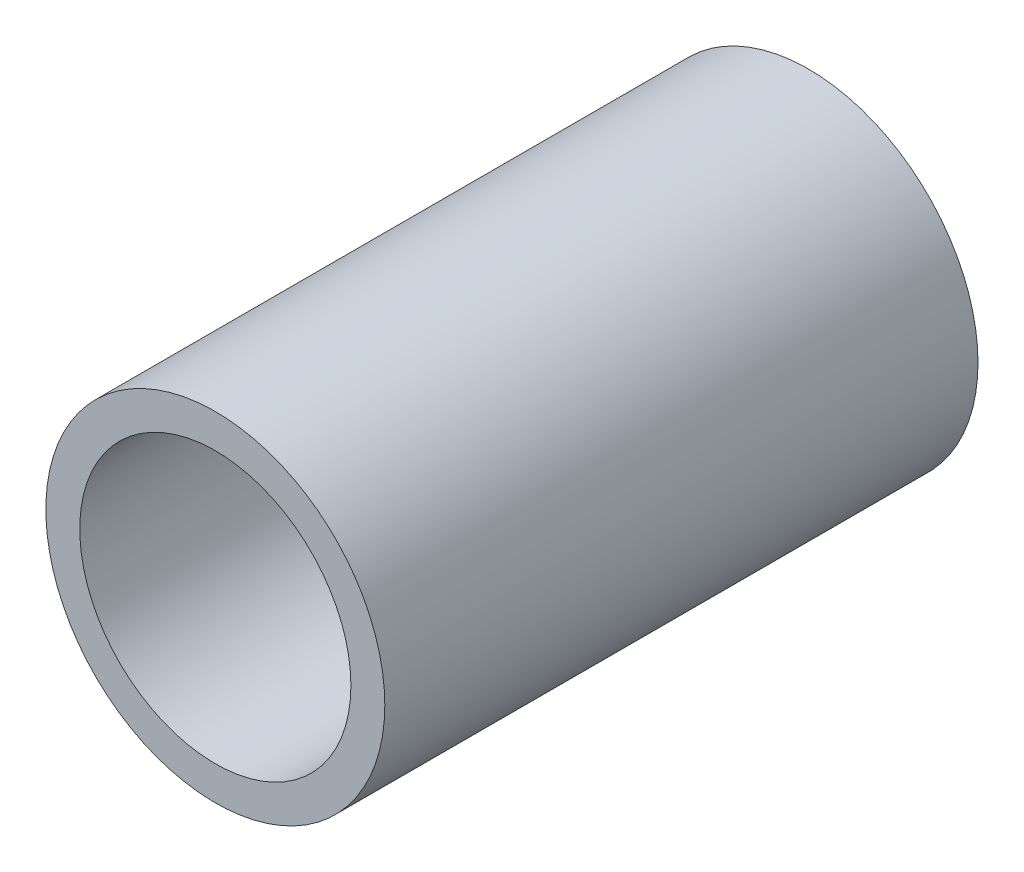
ISO-10303-21;
HEADER;
FILE_DESCRIPTION(('STEP AP214'),'2;1');
FILE_NAME('part.step','',(''),(''),'','','');
FILE_SCHEMA(('AUTOMOTIVE_DESIGN { 1 0 10303 214 1 1 1 1 }'));
ENDSEC;
DATA;
#1=APPLICATION_CONTEXT('core data for automotive mechanical design processes');
#2=APPLICATION_PROTOCOL_DEFINITION('international standard','automotive_design',2000,#1);
#3=PRODUCT_CONTEXT('',#1,'mechanical');
#4=PRODUCT('Part','Part','',(#3));
#5=PRODUCT_RELATED_PRODUCT_CATEGORY('part','',(#4));
#6=PRODUCT_DEFINITION_FORMATION('','',#4);
#7=PRODUCT_DEFINITION_CONTEXT('part definition',#1,'design');
#8=PRODUCT_DEFINITION('design','',#6,#7);
#9=PRODUCT_DEFINITION_SHAPE('','',#8);
#10=(LENGTH_UNIT() NAMED_UNIT(*) SI_UNIT(.MILLI.,.METRE.));
#11=(NAMED_UNIT(*) PLANE_ANGLE_UNIT() SI_UNIT($,.RADIAN.));
#12=(NAMED_UNIT(*) SI_UNIT($,.STERADIAN.) SOLID_ANGLE_UNIT());
#13=UNCERTAINTY_MEASURE_WITH_UNIT(LENGTH_MEASURE(1.E-05),#10,'distance_accuracy_value','');
#14=(GEOMETRIC_REPRESENTATION_CONTEXT(3) GLOBAL_UNCERTAINTY_ASSIGNED_CONTEXT((#13)) GLOBAL_UNIT_ASSIGNED_CONTEXT((#10,
#11,#12)) REPRESENTATION_CONTEXT('',''));
#15=CARTESIAN_POINT('',(0.,0.,0.));
#16=DIRECTION('',(0.,0.,1.));
#17=DIRECTION('',(1.,0.,0.));
#18=AXIS2_PLACEMENT_3D('',#15,#16,#17);
#19=CARTESIAN_POINT('',(0.,0.,17.5));
#20=DIRECTION('',(0.,0.,1.));
#21=DIRECTION('',(1.,0.,0.));
#22=AXIS2_PLACEMENT_3D('',#19,#20,#21);
#23=PLANE('',#22);
#24=CARTESIAN_POINT('',(0.,0.,17.5));
#25=DIRECTION('',(0.,0.,1.));
#26=DIRECTION('',(1.,0.,0.));
#27=AXIS2_PLACEMENT_3D('',#24,#25,#26);
#28=CIRCLE('',#27,5.);
#29=CARTESIAN_POINT('',(5.,0.,17.5));
#30=VERTEX_POINT('',#29);
#31=EDGE_CURVE('E10',#30,#30,#28,.T.);
#32=ORIENTED_EDGE('',*,*,#31,.T.);
#33=EDGE_LOOP('',(#32));
#34=FACE_BOUND('',#33,.T.);
#35=CARTESIAN_POINT('',(0.,0.,17.5));
#36=DIRECTION('',(0.,0.,1.));
#37=DIRECTION('',(1.,0.,0.));
#38=AXIS2_PLACEMENT_3D('',#35,#36,#37);
#39=CIRCLE('',#38,4.);
#40=CARTESIAN_POINT('',(4.,0.,17.5));
#41=VERTEX_POINT('',#40);
#42=EDGE_CURVE('E42',#41,#41,#39,.T.);
#43=ORIENTED_EDGE('',*,*,#42,.F.);
#44=EDGE_LOOP('',(#43));
#45=FACE_BOUND('',#44,.T.);
#46=ADVANCED_FACE('F31',(#34,#45),#23,.T.);
#47=CARTESIAN_POINT('',(0.,0.,0.));
#48=DIRECTION('',(0.,0.,1.));
#49=DIRECTION('',(1.,0.,0.));
#50=AXIS2_PLACEMENT_3D('',#47,#48,#49);
#51=PLANE('',#50);
#52=CARTESIAN_POINT('',(0.,0.,0.));
#53=DIRECTION('',(0.,0.,1.));
#54=DIRECTION('',(1.,0.,0.));
#55=AXIS2_PLACEMENT_3D('',#52,#53,#54);
#56=CIRCLE('',#55,5.);
#57=CARTESIAN_POINT('',(5.,0.,0.));
#58=VERTEX_POINT('',#57);
#59=EDGE_CURVE('E35',#58,#58,#56,.T.);
#60=ORIENTED_EDGE('',*,*,#59,.F.);
#61=EDGE_LOOP('',(#60));
#62=FACE_BOUND('',#61,.T.);
#63=CARTESIAN_POINT('',(0.,0.,0.));
#64=DIRECTION('',(0.,0.,1.));
#65=DIRECTION('',(1.,0.,0.));
#66=AXIS2_PLACEMENT_3D('',#63,#64,#65);
#67=CIRCLE('',#66,4.);
#68=CARTESIAN_POINT('',(4.,0.,0.));
#69=VERTEX_POINT('',#68);
#70=EDGE_CURVE('E44',#69,#69,#67,.T.);
#71=ORIENTED_EDGE('',*,*,#70,.T.);
#72=EDGE_LOOP('',(#71));
#73=FACE_BOUND('',#72,.T.);
#74=ADVANCED_FACE('F54',(#62,#73),#51,.F.);
#75=CARTESIAN_POINT('',(0.,0.,17.5));
#76=DIRECTION('',(0.,0.,-1.));
#77=DIRECTION('',(-1.,0.,0.));
#78=AXIS2_PLACEMENT_3D('',#75,#76,#77);
#79=CYLINDRICAL_SURFACE('',#78,5.);
#80=ORIENTED_EDGE('',*,*,#31,.F.);
#81=EDGE_LOOP('',(#80));
#82=FACE_BOUND('',#81,.T.);
#83=ORIENTED_EDGE('',*,*,#59,.T.);
#84=EDGE_LOOP('',(#83));
#85=FACE_BOUND('',#84,.T.);
#86=ADVANCED_FACE('F33',(#82,#85),#79,.T.);
#87=CARTESIAN_POINT('',(0.,0.,17.5));
#88=DIRECTION('',(0.,0.,-1.));
#89=DIRECTION('',(-1.,0.,0.));
#90=AXIS2_PLACEMENT_3D('',#87,#88,#89);
#91=CYLINDRICAL_SURFACE('',#90,4.);
#92=ORIENTED_EDGE('',*,*,#42,.T.);
#93=EDGE_LOOP('',(#92));
#94=FACE_BOUND('',#93,.T.);
#95=ORIENTED_EDGE('',*,*,#70,.F.);
#96=EDGE_LOOP('',(#95));
#97=FACE_BOUND('',#96,.T.);
#98=ADVANCED_FACE('F50',(#94,#97),#91,.F.);
#99=CLOSED_SHELL('',(#46,#74,#86,#98));
#100=MANIFOLD_SOLID_BREP('B2',#99);
#101=ADVANCED_BREP_SHAPE_REPRESENTATION('',(#18,#100),#14);
#102=SHAPE_DEFINITION_REPRESENTATION(#9,#101);
ENDSEC;
END-ISO-10303-21;
